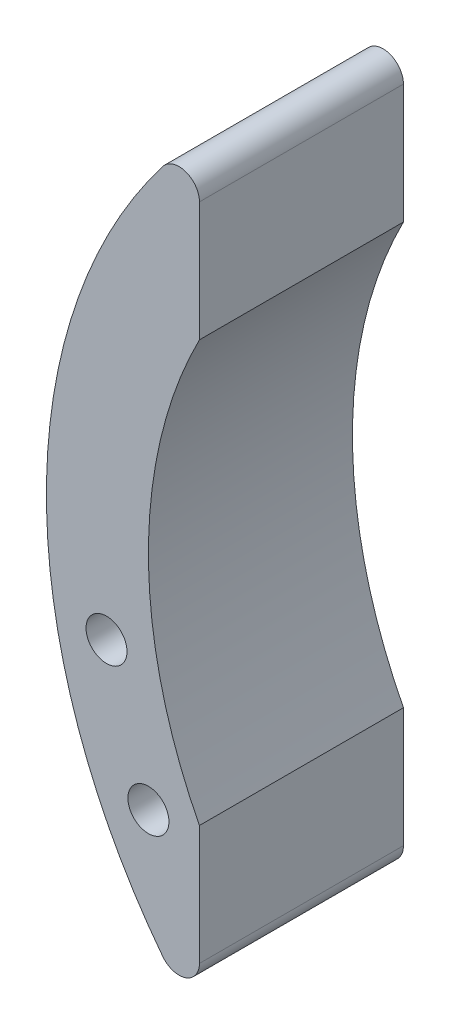
ISO-10303-21;
HEADER;
FILE_DESCRIPTION(('STEP AP214'),'2;1');
FILE_NAME('part.step','',(''),(''),'','','');
FILE_SCHEMA(('AUTOMOTIVE_DESIGN { 1 0 10303 214 1 1 1 1 }'));
ENDSEC;
DATA;
#1=APPLICATION_CONTEXT('core data for automotive mechanical design processes');
#2=APPLICATION_PROTOCOL_DEFINITION('international standard','automotive_design',2000,#1);
#3=PRODUCT_CONTEXT('',#1,'mechanical');
#4=PRODUCT('Part','Part','',(#3));
#5=PRODUCT_RELATED_PRODUCT_CATEGORY('part','',(#4));
#6=PRODUCT_DEFINITION_FORMATION('','',#4);
#7=PRODUCT_DEFINITION_CONTEXT('part definition',#1,'design');
#8=PRODUCT_DEFINITION('design','',#6,#7);
#9=PRODUCT_DEFINITION_SHAPE('','',#8);
#10=(LENGTH_UNIT() NAMED_UNIT(*) SI_UNIT(.MILLI.,.METRE.));
#11=(NAMED_UNIT(*) PLANE_ANGLE_UNIT() SI_UNIT($,.RADIAN.));
#12=(NAMED_UNIT(*) SI_UNIT($,.STERADIAN.) SOLID_ANGLE_UNIT());
#13=UNCERTAINTY_MEASURE_WITH_UNIT(LENGTH_MEASURE(1.E-05),#10,'distance_accuracy_value','');
#14=(GEOMETRIC_REPRESENTATION_CONTEXT(3) GLOBAL_UNCERTAINTY_ASSIGNED_CONTEXT((#13)) GLOBAL_UNIT_ASSIGNED_CONTEXT((#10,
#11,#12)) REPRESENTATION_CONTEXT('',''));
#15=CARTESIAN_POINT('',(0.,0.,0.));
#16=DIRECTION('',(0.,0.,1.));
#17=DIRECTION('',(1.,0.,0.));
#18=AXIS2_PLACEMENT_3D('',#15,#16,#17);
#19=CARTESIAN_POINT('',(0.,0.,12.7));
#20=DIRECTION('',(0.,0.,1.));
#21=DIRECTION('',(1.,0.,0.));
#22=AXIS2_PLACEMENT_3D('',#19,#20,#21);
#23=PLANE('',#22);
#24=CARTESIAN_POINT('',(-57.15,-27.6790082914833,12.7));
#25=DIRECTION('',(0.,0.,1.));
#26=DIRECTION('',(1.,0.,0.));
#27=AXIS2_PLACEMENT_3D('',#24,#25,#26);
#28=CIRCLE('',#27,2.55269999999998);
#29=CARTESIAN_POINT('',(-54.5973,-27.6790082914833,12.7));
#30=VERTEX_POINT('',#29);
#31=EDGE_CURVE('E184',#30,#30,#28,.T.);
#32=ORIENTED_EDGE('',*,*,#31,.F.);
#33=EDGE_LOOP('',(#32));
#34=FACE_BOUND('',#33,.T.);
#35=CARTESIAN_POINT('',(-62.3665154678067,-11.9443605272039,12.7));
#36=DIRECTION('',(0.,0.,1.));
#37=DIRECTION('',(1.,0.,0.));
#38=AXIS2_PLACEMENT_3D('',#35,#36,#37);
#39=CIRCLE('',#38,2.55269999999999);
#40=CARTESIAN_POINT('',(-59.8138154678067,-11.9443605272039,12.7));
#41=VERTEX_POINT('',#40);
#42=EDGE_CURVE('E176',#41,#41,#39,.T.);
#43=ORIENTED_EDGE('',*,*,#42,.F.);
#44=EDGE_LOOP('',(#43));
#45=FACE_BOUND('',#44,.T.);
#46=DIRECTION('',(0.,-1.,0.));
#47=VECTOR('',#46,1.);
#48=CARTESIAN_POINT('',(-50.8,69.1203321230731,12.7));
#49=LINE('',#48,#47);
#50=CARTESIAN_POINT('',(-50.8,41.0546038831213,12.7));
#51=VERTEX_POINT('',#50);
#52=CARTESIAN_POINT('',(-50.8,26.1817207226721,12.7));
#53=VERTEX_POINT('',#52);
#54=EDGE_CURVE('E97',#51,#53,#49,.T.);
#55=ORIENTED_EDGE('',*,*,#54,.F.);
#56=CARTESIAN_POINT('',(-53.34,41.0546038831213,12.7));
#57=DIRECTION('',(0.,0.,1.));
#58=DIRECTION('',(1.,0.,0.));
#59=AXIS2_PLACEMENT_3D('',#56,#57,#58);
#60=CIRCLE('',#59,2.54);
#61=CARTESIAN_POINT('',(-55.3528301886792,42.6038342183334,12.7));
#62=VERTEX_POINT('',#61);
#63=EDGE_CURVE('E53',#51,#62,#60,.T.);
#64=ORIENTED_EDGE('',*,*,#63,.T.);
#65=CARTESIAN_POINT('',(0.,0.,12.7));
#66=DIRECTION('',(0.,0.,1.));
#67=DIRECTION('',(1.,0.,0.));
#68=AXIS2_PLACEMENT_3D('',#65,#66,#67);
#69=CIRCLE('',#68,69.85);
#70=CARTESIAN_POINT('',(-55.3528301886792,-42.6038342183334,12.7));
#71=VERTEX_POINT('',#70);
#72=EDGE_CURVE('E118',#62,#71,#69,.T.);
#73=ORIENTED_EDGE('',*,*,#72,.T.);
#74=CARTESIAN_POINT('',(-53.34,-41.0546038831213,12.7));
#75=DIRECTION('',(0.,0.,1.));
#76=DIRECTION('',(1.,0.,0.));
#77=AXIS2_PLACEMENT_3D('',#74,#75,#76);
#78=CIRCLE('',#77,2.54);
#79=CARTESIAN_POINT('',(-50.8,-41.0546038831213,12.7));
#80=VERTEX_POINT('',#79);
#81=EDGE_CURVE('E60',#71,#80,#78,.T.);
#82=ORIENTED_EDGE('',*,*,#81,.T.);
#83=CARTESIAN_POINT('',(-50.8,-26.1817207226722,12.7));
#84=VERTEX_POINT('',#83);
#85=EDGE_CURVE('E106',#84,#80,#49,.T.);
#86=ORIENTED_EDGE('',*,*,#85,.F.);
#87=CARTESIAN_POINT('',(0.,0.,12.7));
#88=DIRECTION('',(0.,0.,1.));
#89=DIRECTION('',(1.,0.,0.));
#90=AXIS2_PLACEMENT_3D('',#87,#88,#89);
#91=CIRCLE('',#90,57.15);
#92=EDGE_CURVE('E112',#53,#84,#91,.T.);
#93=ORIENTED_EDGE('',*,*,#92,.F.);
#94=EDGE_LOOP('',(#55,#64,#73,#82,#86,#93));
#95=FACE_BOUND('',#94,.T.);
#96=ADVANCED_FACE('F44',(#34,#45,#95),#23,.T.);
#97=CARTESIAN_POINT('',(0.,0.,12.7));
#98=DIRECTION('',(0.,0.,-1.));
#99=DIRECTION('',(-1.,0.,0.));
#100=AXIS2_PLACEMENT_3D('',#97,#98,#99);
#101=CYLINDRICAL_SURFACE('',#100,69.85);
#102=ORIENTED_EDGE('',*,*,#72,.F.);
#103=DIRECTION('',(0.,0.,-1.));
#104=VECTOR('',#103,1.);
#105=CARTESIAN_POINT('',(-55.3528301886792,42.6038342183334,12.7));
#106=LINE('',#105,#104);
#107=CARTESIAN_POINT('',(-55.3528301886792,42.6038342183334,-12.7));
#108=VERTEX_POINT('',#107);
#109=EDGE_CURVE('E137',#62,#108,#106,.T.);
#110=ORIENTED_EDGE('',*,*,#109,.T.);
#111=CARTESIAN_POINT('',(0.,0.,-12.7));
#112=DIRECTION('',(0.,0.,1.));
#113=DIRECTION('',(1.,0.,0.));
#114=AXIS2_PLACEMENT_3D('',#111,#112,#113);
#115=CIRCLE('',#114,69.85);
#116=CARTESIAN_POINT('',(-55.3528301886792,-42.6038342183334,-12.7));
#117=VERTEX_POINT('',#116);
#118=EDGE_CURVE('E119',#108,#117,#115,.T.);
#119=ORIENTED_EDGE('',*,*,#118,.T.);
#120=DIRECTION('',(0.,0.,-1.));
#121=VECTOR('',#120,1.);
#122=CARTESIAN_POINT('',(-55.3528301886792,-42.6038342183335,12.7));
#123=LINE('',#122,#121);
#124=EDGE_CURVE('E133',#117,#71,#123,.F.);
#125=ORIENTED_EDGE('',*,*,#124,.T.);
#126=EDGE_LOOP('',(#102,#110,#119,#125));
#127=FACE_BOUND('',#126,.T.);
#128=ADVANCED_FACE('F155',(#127),#101,.T.);
#129=CARTESIAN_POINT('',(0.,0.,12.7));
#130=DIRECTION('',(0.,0.,-1.));
#131=DIRECTION('',(-1.,0.,0.));
#132=AXIS2_PLACEMENT_3D('',#129,#130,#131);
#133=CYLINDRICAL_SURFACE('',#132,57.15);
#134=DIRECTION('',(0.,0.,-1.));
#135=VECTOR('',#134,1.);
#136=CARTESIAN_POINT('',(-50.8,26.1817207226721,12.7));
#137=LINE('',#136,#135);
#138=CARTESIAN_POINT('',(-50.8,26.1817207226721,-12.7));
#139=VERTEX_POINT('',#138);
#140=EDGE_CURVE('E100',#53,#139,#137,.T.);
#141=ORIENTED_EDGE('',*,*,#140,.F.);
#142=ORIENTED_EDGE('',*,*,#92,.T.);
#143=DIRECTION('',(0.,0.,-1.));
#144=VECTOR('',#143,1.);
#145=CARTESIAN_POINT('',(-50.8,-26.1817207226722,12.7));
#146=LINE('',#145,#144);
#147=CARTESIAN_POINT('',(-50.8,-26.1817207226722,-12.7));
#148=VERTEX_POINT('',#147);
#149=EDGE_CURVE('E105',#148,#84,#146,.F.);
#150=ORIENTED_EDGE('',*,*,#149,.F.);
#151=CARTESIAN_POINT('',(0.,0.,-12.7));
#152=DIRECTION('',(0.,0.,1.));
#153=DIRECTION('',(1.,0.,0.));
#154=AXIS2_PLACEMENT_3D('',#151,#152,#153);
#155=CIRCLE('',#154,57.15);
#156=EDGE_CURVE('E114',#139,#148,#155,.T.);
#157=ORIENTED_EDGE('',*,*,#156,.F.);
#158=EDGE_LOOP('',(#141,#142,#150,#157));
#159=FACE_BOUND('',#158,.T.);
#160=ADVANCED_FACE('F110',(#159),#133,.F.);
#161=CARTESIAN_POINT('',(0.,0.,-12.7));
#162=DIRECTION('',(0.,0.,1.));
#163=DIRECTION('',(1.,0.,0.));
#164=AXIS2_PLACEMENT_3D('',#161,#162,#163);
#165=PLANE('',#164);
#166=CARTESIAN_POINT('',(-57.15,-27.6790082914833,-12.7));
#167=DIRECTION('',(0.,0.,1.));
#168=DIRECTION('',(1.,0.,0.));
#169=AXIS2_PLACEMENT_3D('',#166,#167,#168);
#170=CIRCLE('',#169,2.5527);
#171=CARTESIAN_POINT('',(-54.5973,-27.6790082914833,-12.7));
#172=VERTEX_POINT('',#171);
#173=EDGE_CURVE('E180',#172,#172,#170,.T.);
#174=ORIENTED_EDGE('',*,*,#173,.T.);
#175=EDGE_LOOP('',(#174));
#176=FACE_BOUND('',#175,.T.);
#177=CARTESIAN_POINT('',(-62.3665154678067,-11.9443605272039,-12.7));
#178=DIRECTION('',(0.,0.,1.));
#179=DIRECTION('',(1.,0.,0.));
#180=AXIS2_PLACEMENT_3D('',#177,#178,#179);
#181=CIRCLE('',#180,2.5527);
#182=CARTESIAN_POINT('',(-59.8138154678067,-11.9443605272039,-12.7));
#183=VERTEX_POINT('',#182);
#184=EDGE_CURVE('E172',#183,#183,#181,.T.);
#185=ORIENTED_EDGE('',*,*,#184,.T.);
#186=EDGE_LOOP('',(#185));
#187=FACE_BOUND('',#186,.T.);
#188=ORIENTED_EDGE('',*,*,#118,.F.);
#189=CARTESIAN_POINT('',(-53.34,41.0546038831213,-12.7));
#190=DIRECTION('',(0.,0.,1.));
#191=DIRECTION('',(1.,0.,0.));
#192=AXIS2_PLACEMENT_3D('',#189,#190,#191);
#193=CIRCLE('',#192,2.54);
#194=CARTESIAN_POINT('',(-50.8,41.0546038831213,-12.7));
#195=VERTEX_POINT('',#194);
#196=EDGE_CURVE('E144',#108,#195,#193,.F.);
#197=ORIENTED_EDGE('',*,*,#196,.T.);
#198=DIRECTION('',(0.,-1.,0.));
#199=VECTOR('',#198,1.);
#200=CARTESIAN_POINT('',(-50.8,0.,-12.7));
#201=LINE('',#200,#199);
#202=EDGE_CURVE('E132',#195,#139,#201,.T.);
#203=ORIENTED_EDGE('',*,*,#202,.T.);
#204=ORIENTED_EDGE('',*,*,#156,.T.);
#205=CARTESIAN_POINT('',(-50.8,-41.0546038831213,-12.7));
#206=VERTEX_POINT('',#205);
#207=EDGE_CURVE('E123',#148,#206,#201,.T.);
#208=ORIENTED_EDGE('',*,*,#207,.T.);
#209=CARTESIAN_POINT('',(-53.34,-41.0546038831213,-12.7));
#210=DIRECTION('',(0.,0.,1.));
#211=DIRECTION('',(1.,0.,0.));
#212=AXIS2_PLACEMENT_3D('',#209,#210,#211);
#213=CIRCLE('',#212,2.54);
#214=EDGE_CURVE('E141',#206,#117,#213,.F.);
#215=ORIENTED_EDGE('',*,*,#214,.T.);
#216=EDGE_LOOP('',(#188,#197,#203,#204,#208,#215));
#217=FACE_BOUND('',#216,.T.);
#218=ADVANCED_FACE('F160',(#176,#187,#217),#165,.F.);
#219=CARTESIAN_POINT('',(-50.8,69.1203321230731,-12.7));
#220=DIRECTION('',(-1.,0.,0.));
#221=DIRECTION('',(0.,-1.,0.));
#222=AXIS2_PLACEMENT_3D('',#219,#220,#221);
#223=PLANE('',#222);
#224=ORIENTED_EDGE('',*,*,#85,.T.);
#225=DIRECTION('',(0.,0.,-1.));
#226=VECTOR('',#225,1.);
#227=CARTESIAN_POINT('',(-50.8,-41.0546038831213,-12.7));
#228=LINE('',#227,#226);
#229=EDGE_CURVE('E11',#80,#206,#228,.T.);
#230=ORIENTED_EDGE('',*,*,#229,.T.);
#231=ORIENTED_EDGE('',*,*,#207,.F.);
#232=ORIENTED_EDGE('',*,*,#149,.T.);
#233=EDGE_LOOP('',(#224,#230,#231,#232));
#234=FACE_BOUND('',#233,.T.);
#235=ADVANCED_FACE('F166',(#234),#223,.F.);
#236=ORIENTED_EDGE('',*,*,#202,.F.);
#237=DIRECTION('',(0.,0.,-1.));
#238=VECTOR('',#237,1.);
#239=CARTESIAN_POINT('',(-50.8,41.0546038831213,-12.7));
#240=LINE('',#239,#238);
#241=EDGE_CURVE('E68',#195,#51,#240,.F.);
#242=ORIENTED_EDGE('',*,*,#241,.T.);
#243=ORIENTED_EDGE('',*,*,#54,.T.);
#244=ORIENTED_EDGE('',*,*,#140,.T.);
#245=EDGE_LOOP('',(#236,#242,#243,#244));
#246=FACE_BOUND('',#245,.T.);
#247=ADVANCED_FACE('F99',(#246),#223,.F.);
#248=CARTESIAN_POINT('',(-62.3665154678067,-11.9443605272039,12.7));
#249=DIRECTION('',(0.,0.,1.));
#250=DIRECTION('',(1.,0.,0.));
#251=AXIS2_PLACEMENT_3D('',#248,#249,#250);
#252=CYLINDRICAL_SURFACE('',#251,2.55269999999999);
#253=ORIENTED_EDGE('',*,*,#184,.F.);
#254=EDGE_LOOP('',(#253));
#255=FACE_BOUND('',#254,.T.);
#256=ORIENTED_EDGE('',*,*,#42,.T.);
#257=EDGE_LOOP('',(#256));
#258=FACE_BOUND('',#257,.T.);
#259=ADVANCED_FACE('F196',(#255,#258),#252,.F.);
#260=CARTESIAN_POINT('',(-57.15,-27.6790082914833,12.7));
#261=DIRECTION('',(0.,0.,1.));
#262=DIRECTION('',(1.,0.,0.));
#263=AXIS2_PLACEMENT_3D('',#260,#261,#262);
#264=CYLINDRICAL_SURFACE('',#263,2.55269999999999);
#265=ORIENTED_EDGE('',*,*,#173,.F.);
#266=EDGE_LOOP('',(#265));
#267=FACE_BOUND('',#266,.T.);
#268=ORIENTED_EDGE('',*,*,#31,.T.);
#269=EDGE_LOOP('',(#268));
#270=FACE_BOUND('',#269,.T.);
#271=ADVANCED_FACE('F189',(#267,#270),#264,.F.);
#272=CARTESIAN_POINT('',(-53.34,41.0546038831213,12.7));
#273=DIRECTION('',(0.,0.,-1.));
#274=DIRECTION('',(-1.,0.,0.));
#275=AXIS2_PLACEMENT_3D('',#272,#273,#274);
#276=CYLINDRICAL_SURFACE('',#275,2.54);
#277=ORIENTED_EDGE('',*,*,#63,.F.);
#278=ORIENTED_EDGE('',*,*,#241,.F.);
#279=ORIENTED_EDGE('',*,*,#196,.F.);
#280=ORIENTED_EDGE('',*,*,#109,.F.);
#281=EDGE_LOOP('',(#277,#278,#279,#280));
#282=FACE_BOUND('',#281,.T.);
#283=ADVANCED_FACE('F158',(#282),#276,.T.);
#284=CARTESIAN_POINT('',(-53.34,-41.0546038831213,12.7));
#285=DIRECTION('',(0.,0.,-1.));
#286=DIRECTION('',(-1.,0.,0.));
#287=AXIS2_PLACEMENT_3D('',#284,#285,#286);
#288=CYLINDRICAL_SURFACE('',#287,2.54);
#289=ORIENTED_EDGE('',*,*,#214,.F.);
#290=ORIENTED_EDGE('',*,*,#229,.F.);
#291=ORIENTED_EDGE('',*,*,#81,.F.);
#292=ORIENTED_EDGE('',*,*,#124,.F.);
#293=EDGE_LOOP('',(#289,#290,#291,#292));
#294=FACE_BOUND('',#293,.T.);
#295=ADVANCED_FACE('F46',(#294),#288,.T.);
#296=CLOSED_SHELL('',(#96,#128,#160,#218,#235,#247,#259,#271,#283,#295));
#297=MANIFOLD_SOLID_BREP('B2',#296);
#298=ADVANCED_BREP_SHAPE_REPRESENTATION('',(#18,#297),#14);
#299=SHAPE_DEFINITION_REPRESENTATION(#9,#298);
ENDSEC;
END-ISO-10303-21;
